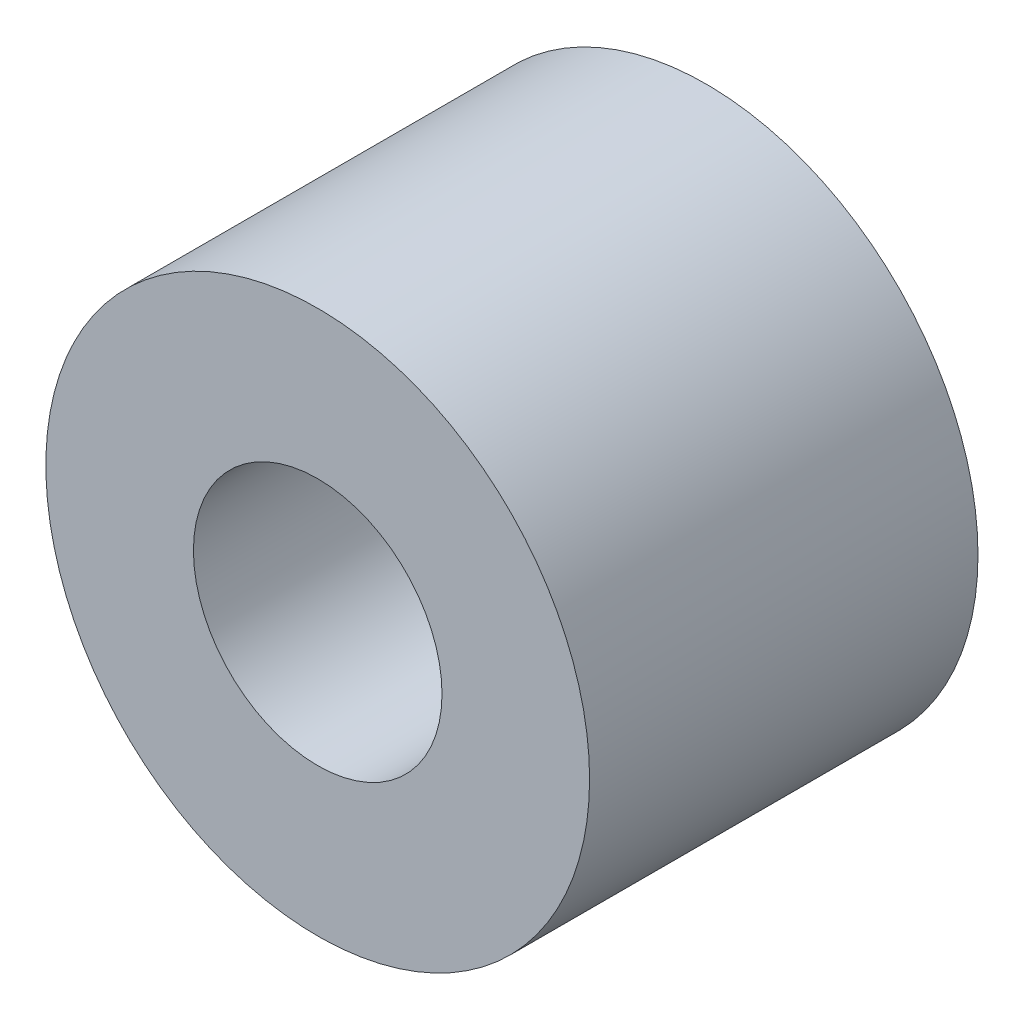
ISO-10303-21;
HEADER;
FILE_DESCRIPTION(('STEP AP214'),'2;1');
FILE_NAME('part.step','',(''),(''),'','','');
FILE_SCHEMA(('AUTOMOTIVE_DESIGN { 1 0 10303 214 1 1 1 1 }'));
ENDSEC;
DATA;
#1=APPLICATION_CONTEXT('core data for automotive mechanical design processes');
#2=APPLICATION_PROTOCOL_DEFINITION('international standard','automotive_design',2000,#1);
#3=PRODUCT_CONTEXT('',#1,'mechanical');
#4=PRODUCT('Part','Part','',(#3));
#5=PRODUCT_RELATED_PRODUCT_CATEGORY('part','',(#4));
#6=PRODUCT_DEFINITION_FORMATION('','',#4);
#7=PRODUCT_DEFINITION_CONTEXT('part definition',#1,'design');
#8=PRODUCT_DEFINITION('design','',#6,#7);
#9=PRODUCT_DEFINITION_SHAPE('','',#8);
#10=(LENGTH_UNIT() NAMED_UNIT(*) SI_UNIT(.MILLI.,.METRE.));
#11=(NAMED_UNIT(*) PLANE_ANGLE_UNIT() SI_UNIT($,.RADIAN.));
#12=(NAMED_UNIT(*) SI_UNIT($,.STERADIAN.) SOLID_ANGLE_UNIT());
#13=UNCERTAINTY_MEASURE_WITH_UNIT(LENGTH_MEASURE(1.E-05),#10,'distance_accuracy_value','');
#14=(GEOMETRIC_REPRESENTATION_CONTEXT(3) GLOBAL_UNCERTAINTY_ASSIGNED_CONTEXT((#13)) GLOBAL_UNIT_ASSIGNED_CONTEXT((#10,
#11,#12)) REPRESENTATION_CONTEXT('',''));
#15=CARTESIAN_POINT('',(0.,0.,0.));
#16=DIRECTION('',(0.,0.,1.));
#17=DIRECTION('',(1.,0.,0.));
#18=AXIS2_PLACEMENT_3D('',#15,#16,#17);
#19=CARTESIAN_POINT('',(0.,0.,5.));
#20=DIRECTION('',(0.,0.,1.));
#21=DIRECTION('',(1.,0.,0.));
#22=AXIS2_PLACEMENT_3D('',#19,#20,#21);
#23=PLANE('',#22);
#24=CARTESIAN_POINT('',(0.,0.,5.));
#25=DIRECTION('',(0.,0.,1.));
#26=DIRECTION('',(1.,0.,0.));
#27=AXIS2_PLACEMENT_3D('',#24,#25,#26);
#28=CIRCLE('',#27,3.5);
#29=CARTESIAN_POINT('',(3.5,0.,5.));
#30=VERTEX_POINT('',#29);
#31=EDGE_CURVE('E10',#30,#30,#28,.T.);
#32=ORIENTED_EDGE('',*,*,#31,.T.);
#33=EDGE_LOOP('',(#32));
#34=FACE_BOUND('',#33,.T.);
#35=CARTESIAN_POINT('',(0.,0.,5.));
#36=DIRECTION('',(0.,0.,1.));
#37=DIRECTION('',(1.,0.,0.));
#38=AXIS2_PLACEMENT_3D('',#35,#36,#37);
#39=CIRCLE('',#38,1.6);
#40=CARTESIAN_POINT('',(1.6,0.,5.));
#41=VERTEX_POINT('',#40);
#42=EDGE_CURVE('E44',#41,#41,#39,.T.);
#43=ORIENTED_EDGE('',*,*,#42,.F.);
#44=EDGE_LOOP('',(#43));
#45=FACE_BOUND('',#44,.T.);
#46=ADVANCED_FACE('F33',(#34,#45),#23,.T.);
#47=CARTESIAN_POINT('',(0.,0.,0.));
#48=DIRECTION('',(0.,0.,1.));
#49=DIRECTION('',(1.,0.,0.));
#50=AXIS2_PLACEMENT_3D('',#47,#48,#49);
#51=PLANE('',#50);
#52=CARTESIAN_POINT('',(0.,0.,0.));
#53=DIRECTION('',(0.,0.,1.));
#54=DIRECTION('',(1.,0.,0.));
#55=AXIS2_PLACEMENT_3D('',#52,#53,#54);
#56=CIRCLE('',#55,3.5);
#57=CARTESIAN_POINT('',(3.5,0.,0.));
#58=VERTEX_POINT('',#57);
#59=EDGE_CURVE('E37',#58,#58,#56,.T.);
#60=ORIENTED_EDGE('',*,*,#59,.F.);
#61=EDGE_LOOP('',(#60));
#62=FACE_BOUND('',#61,.T.);
#63=CARTESIAN_POINT('',(0.,0.,0.));
#64=DIRECTION('',(0.,0.,1.));
#65=DIRECTION('',(1.,0.,0.));
#66=AXIS2_PLACEMENT_3D('',#63,#64,#65);
#67=CIRCLE('',#66,1.6);
#68=CARTESIAN_POINT('',(1.6,0.,0.));
#69=VERTEX_POINT('',#68);
#70=EDGE_CURVE('E46',#69,#69,#67,.T.);
#71=ORIENTED_EDGE('',*,*,#70,.T.);
#72=EDGE_LOOP('',(#71));
#73=FACE_BOUND('',#72,.T.);
#74=ADVANCED_FACE('F56',(#62,#73),#51,.F.);
#75=CARTESIAN_POINT('',(0.,0.,5.));
#76=DIRECTION('',(0.,0.,-1.));
#77=DIRECTION('',(-1.,0.,0.));
#78=AXIS2_PLACEMENT_3D('',#75,#76,#77);
#79=CYLINDRICAL_SURFACE('',#78,3.5);
#80=ORIENTED_EDGE('',*,*,#31,.F.);
#81=EDGE_LOOP('',(#80));
#82=FACE_BOUND('',#81,.T.);
#83=ORIENTED_EDGE('',*,*,#59,.T.);
#84=EDGE_LOOP('',(#83));
#85=FACE_BOUND('',#84,.T.);
#86=ADVANCED_FACE('F35',(#82,#85),#79,.T.);
#87=CARTESIAN_POINT('',(0.,0.,5.));
#88=DIRECTION('',(0.,0.,-1.));
#89=DIRECTION('',(-1.,0.,0.));
#90=AXIS2_PLACEMENT_3D('',#87,#88,#89);
#91=CYLINDRICAL_SURFACE('',#90,1.6);
#92=ORIENTED_EDGE('',*,*,#42,.T.);
#93=EDGE_LOOP('',(#92));
#94=FACE_BOUND('',#93,.T.);
#95=ORIENTED_EDGE('',*,*,#70,.F.);
#96=EDGE_LOOP('',(#95));
#97=FACE_BOUND('',#96,.T.);
#98=ADVANCED_FACE('F52',(#94,#97),#91,.F.);
#99=CLOSED_SHELL('',(#46,#74,#86,#98));
#100=MANIFOLD_SOLID_BREP('B2',#99);
#101=ADVANCED_BREP_SHAPE_REPRESENTATION('',(#18,#100),#14);
#102=SHAPE_DEFINITION_REPRESENTATION(#9,#101);
ENDSEC;
END-ISO-10303-21;
